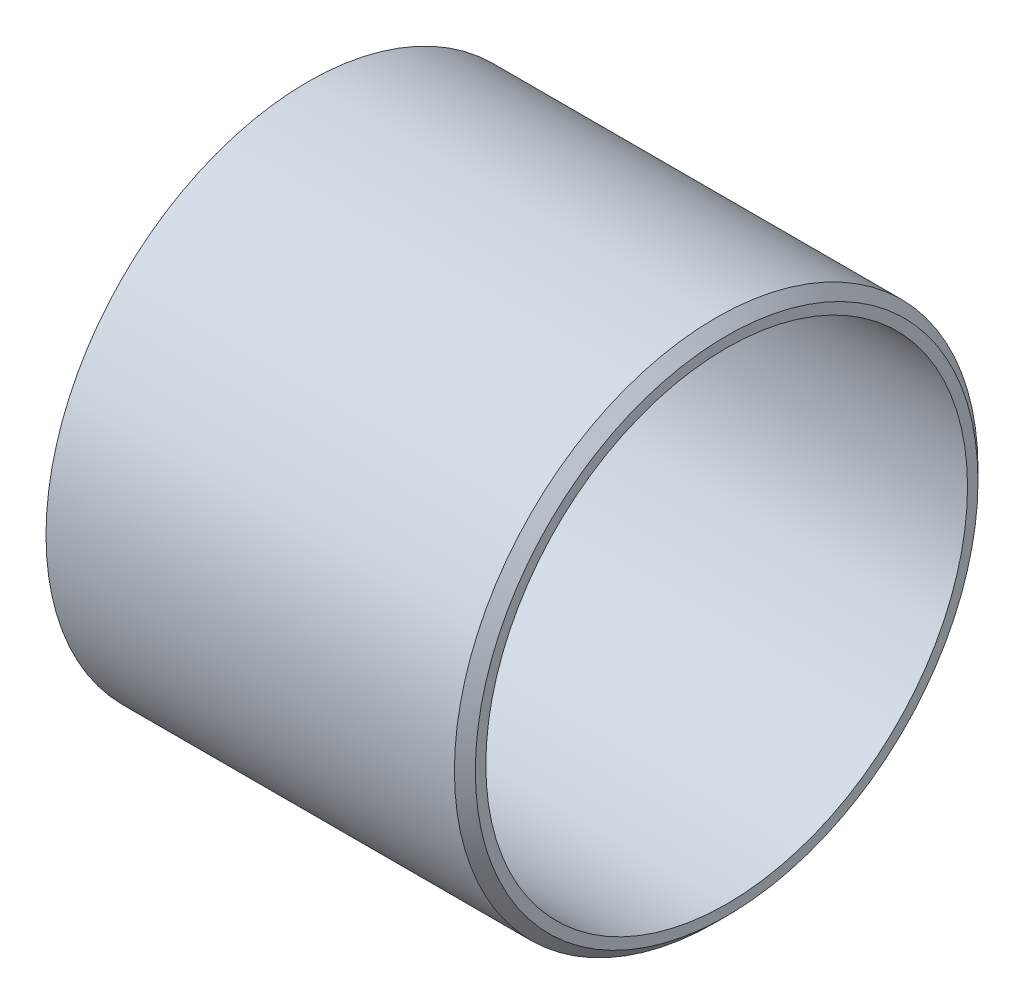
ISO-10303-21;
HEADER;
FILE_DESCRIPTION(('STEP AP214'),'2;1');
FILE_NAME('part.step','',(''),(''),'','','');
FILE_SCHEMA(('AUTOMOTIVE_DESIGN { 1 0 10303 214 1 1 1 1 }'));
ENDSEC;
DATA;
#1=APPLICATION_CONTEXT('core data for automotive mechanical design processes');
#2=APPLICATION_PROTOCOL_DEFINITION('international standard','automotive_design',2000,#1);
#3=PRODUCT_CONTEXT('',#1,'mechanical');
#4=PRODUCT('Part','Part','',(#3));
#5=PRODUCT_RELATED_PRODUCT_CATEGORY('part','',(#4));
#6=PRODUCT_DEFINITION_FORMATION('','',#4);
#7=PRODUCT_DEFINITION_CONTEXT('part definition',#1,'design');
#8=PRODUCT_DEFINITION('design','',#6,#7);
#9=PRODUCT_DEFINITION_SHAPE('','',#8);
#10=(LENGTH_UNIT() NAMED_UNIT(*) SI_UNIT(.MILLI.,.METRE.));
#11=(NAMED_UNIT(*) PLANE_ANGLE_UNIT() SI_UNIT($,.RADIAN.));
#12=(NAMED_UNIT(*) SI_UNIT($,.STERADIAN.) SOLID_ANGLE_UNIT());
#13=UNCERTAINTY_MEASURE_WITH_UNIT(LENGTH_MEASURE(1.E-05),#10,'distance_accuracy_value','');
#14=(GEOMETRIC_REPRESENTATION_CONTEXT(3) GLOBAL_UNCERTAINTY_ASSIGNED_CONTEXT((#13)) GLOBAL_UNIT_ASSIGNED_CONTEXT((#10,
#11,#12)) REPRESENTATION_CONTEXT('',''));
#15=CARTESIAN_POINT('',(0.,0.,0.));
#16=DIRECTION('',(0.,0.,1.));
#17=DIRECTION('',(1.,0.,0.));
#18=AXIS2_PLACEMENT_3D('',#15,#16,#17);
#19=CARTESIAN_POINT('',(20.,23.,0.));
#20=DIRECTION('',(-1.,0.,0.));
#21=DIRECTION('',(0.,0.,1.));
#22=AXIS2_PLACEMENT_3D('',#19,#20,#21);
#23=PLANE('',#22);
#24=CARTESIAN_POINT('',(20.,0.,0.));
#25=DIRECTION('',(-1.,0.,0.));
#26=DIRECTION('',(0.,0.,1.));
#27=AXIS2_PLACEMENT_3D('',#24,#25,#26);
#28=CIRCLE('',#27,24.);
#29=CARTESIAN_POINT('',(20.,0.,24.));
#30=VERTEX_POINT('',#29);
#31=EDGE_CURVE('E10',#30,#30,#28,.F.);
#32=ORIENTED_EDGE('',*,*,#31,.T.);
#33=EDGE_LOOP('',(#32));
#34=FACE_BOUND('',#33,.T.);
#35=CARTESIAN_POINT('',(20.,0.,0.));
#36=DIRECTION('',(-1.,0.,0.));
#37=DIRECTION('',(0.,0.,1.));
#38=AXIS2_PLACEMENT_3D('',#35,#36,#37);
#39=CIRCLE('',#38,23.);
#40=CARTESIAN_POINT('',(20.,0.,23.));
#41=VERTEX_POINT('',#40);
#42=EDGE_CURVE('E59',#41,#41,#39,.T.);
#43=ORIENTED_EDGE('',*,*,#42,.T.);
#44=EDGE_LOOP('',(#43));
#45=FACE_BOUND('',#44,.T.);
#46=ADVANCED_FACE('F38',(#34,#45),#23,.F.);
#47=CARTESIAN_POINT('',(0.,0.,0.));
#48=DIRECTION('',(-1.,0.,0.));
#49=DIRECTION('',(0.,0.,1.));
#50=AXIS2_PLACEMENT_3D('',#47,#48,#49);
#51=CYLINDRICAL_SURFACE('',#50,25.);
#52=CARTESIAN_POINT('',(19.,0.,0.));
#53=DIRECTION('',(-1.,0.,0.));
#54=DIRECTION('',(0.,0.,1.));
#55=AXIS2_PLACEMENT_3D('',#52,#53,#54);
#56=CIRCLE('',#55,25.);
#57=CARTESIAN_POINT('',(19.,0.,25.));
#58=VERTEX_POINT('',#57);
#59=EDGE_CURVE('E46',#58,#58,#56,.T.);
#60=ORIENTED_EDGE('',*,*,#59,.T.);
#61=EDGE_LOOP('',(#60));
#62=FACE_BOUND('',#61,.T.);
#63=CARTESIAN_POINT('',(-20.,0.,0.));
#64=DIRECTION('',(-1.,0.,0.));
#65=DIRECTION('',(0.,0.,1.));
#66=AXIS2_PLACEMENT_3D('',#63,#64,#65);
#67=CIRCLE('',#66,25.);
#68=CARTESIAN_POINT('',(-20.,0.,25.));
#69=VERTEX_POINT('',#68);
#70=EDGE_CURVE('E50',#69,#69,#67,.T.);
#71=ORIENTED_EDGE('',*,*,#70,.F.);
#72=EDGE_LOOP('',(#71));
#73=FACE_BOUND('',#72,.T.);
#74=ADVANCED_FACE('F73',(#62,#73),#51,.T.);
#75=CARTESIAN_POINT('',(-20.,25.,0.));
#76=DIRECTION('',(1.,0.,0.));
#77=DIRECTION('',(0.,0.,-1.));
#78=AXIS2_PLACEMENT_3D('',#75,#76,#77);
#79=PLANE('',#78);
#80=CARTESIAN_POINT('',(-20.,0.,0.));
#81=DIRECTION('',(-1.,0.,0.));
#82=DIRECTION('',(0.,0.,1.));
#83=AXIS2_PLACEMENT_3D('',#80,#81,#82);
#84=CIRCLE('',#83,23.);
#85=CARTESIAN_POINT('',(-20.,0.,23.));
#86=VERTEX_POINT('',#85);
#87=EDGE_CURVE('E54',#86,#86,#84,.T.);
#88=ORIENTED_EDGE('',*,*,#87,.F.);
#89=EDGE_LOOP('',(#88));
#90=FACE_BOUND('',#89,.T.);
#91=ORIENTED_EDGE('',*,*,#70,.T.);
#92=EDGE_LOOP('',(#91));
#93=FACE_BOUND('',#92,.T.);
#94=ADVANCED_FACE('F67',(#90,#93),#79,.F.);
#95=CARTESIAN_POINT('',(0.,0.,0.));
#96=DIRECTION('',(-1.,0.,0.));
#97=DIRECTION('',(0.,0.,1.));
#98=AXIS2_PLACEMENT_3D('',#95,#96,#97);
#99=CYLINDRICAL_SURFACE('',#98,23.);
#100=ORIENTED_EDGE('',*,*,#42,.F.);
#101=EDGE_LOOP('',(#100));
#102=FACE_BOUND('',#101,.T.);
#103=ORIENTED_EDGE('',*,*,#87,.T.);
#104=EDGE_LOOP('',(#103));
#105=FACE_BOUND('',#104,.T.);
#106=ADVANCED_FACE('F64',(#102,#105),#99,.F.);
#107=CARTESIAN_POINT('',(19.,0.,0.));
#108=DIRECTION('',(-1.,0.,0.));
#109=DIRECTION('',(0.,0.,1.));
#110=AXIS2_PLACEMENT_3D('',#107,#108,#109);
#111=CONICAL_SURFACE('',#110,25.,0.78539816339745);
#112=ORIENTED_EDGE('',*,*,#31,.F.);
#113=EDGE_LOOP('',(#112));
#114=FACE_BOUND('',#113,.T.);
#115=ORIENTED_EDGE('',*,*,#59,.F.);
#116=EDGE_LOOP('',(#115));
#117=FACE_BOUND('',#116,.T.);
#118=ADVANCED_FACE('F41',(#114,#117),#111,.T.);
#119=CLOSED_SHELL('',(#46,#74,#94,#106,#118));
#120=MANIFOLD_SOLID_BREP('B2',#119);
#121=ADVANCED_BREP_SHAPE_REPRESENTATION('',(#18,#120),#14);
#122=SHAPE_DEFINITION_REPRESENTATION(#9,#121);
ENDSEC;
END-ISO-10303-21;
